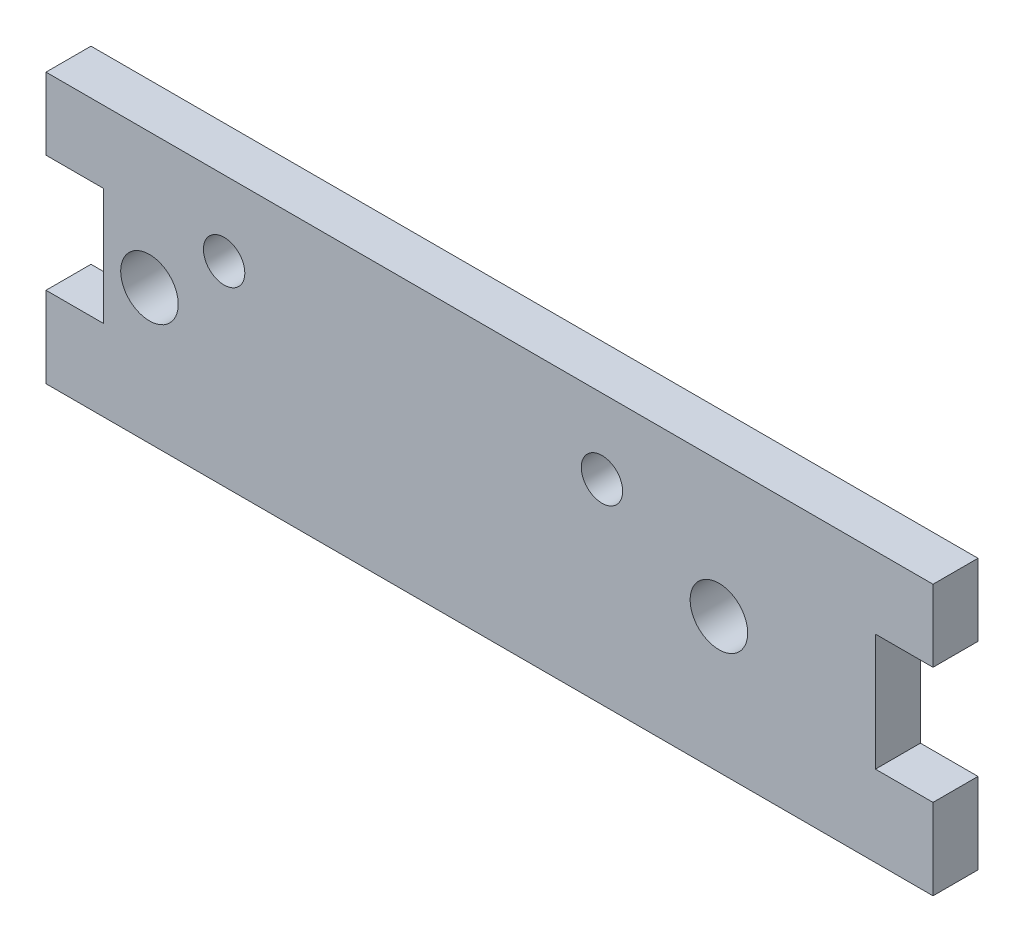
ISO-10303-21;
HEADER;
FILE_DESCRIPTION(('STEP AP214'),'2;1');
FILE_NAME('part.step','',(''),(''),'','','');
FILE_SCHEMA(('AUTOMOTIVE_DESIGN { 1 0 10303 214 1 1 1 1 }'));
ENDSEC;
DATA;
#1=APPLICATION_CONTEXT('core data for automotive mechanical design processes');
#2=APPLICATION_PROTOCOL_DEFINITION('international standard','automotive_design',2000,#1);
#3=PRODUCT_CONTEXT('',#1,'mechanical');
#4=PRODUCT('Part','Part','',(#3));
#5=PRODUCT_RELATED_PRODUCT_CATEGORY('part','',(#4));
#6=PRODUCT_DEFINITION_FORMATION('','',#4);
#7=PRODUCT_DEFINITION_CONTEXT('part definition',#1,'design');
#8=PRODUCT_DEFINITION('design','',#6,#7);
#9=PRODUCT_DEFINITION_SHAPE('','',#8);
#10=(LENGTH_UNIT() NAMED_UNIT(*) SI_UNIT(.MILLI.,.METRE.));
#11=(NAMED_UNIT(*) PLANE_ANGLE_UNIT() SI_UNIT($,.RADIAN.));
#12=(NAMED_UNIT(*) SI_UNIT($,.STERADIAN.) SOLID_ANGLE_UNIT());
#13=UNCERTAINTY_MEASURE_WITH_UNIT(LENGTH_MEASURE(1.E-05),#10,'distance_accuracy_value','');
#14=(GEOMETRIC_REPRESENTATION_CONTEXT(3) GLOBAL_UNCERTAINTY_ASSIGNED_CONTEXT((#13)) GLOBAL_UNIT_ASSIGNED_CONTEXT((#10,
#11,#12)) REPRESENTATION_CONTEXT('',''));
#15=CARTESIAN_POINT('',(0.,0.,0.));
#16=DIRECTION('',(0.,0.,1.));
#17=DIRECTION('',(1.,0.,0.));
#18=AXIS2_PLACEMENT_3D('',#15,#16,#17);
#19=CARTESIAN_POINT('',(49.3,0.,2.5));
#20=DIRECTION('',(-1.,0.,0.));
#21=DIRECTION('',(0.,0.,1.));
#22=AXIS2_PLACEMENT_3D('',#19,#20,#21);
#23=PLANE('',#22);
#24=DIRECTION('',(0.,0.,1.));
#25=VECTOR('',#24,1.);
#26=CARTESIAN_POINT('',(49.3,4.5,-7.5));
#27=LINE('',#26,#25);
#28=CARTESIAN_POINT('',(49.3,4.5,0.));
#29=VERTEX_POINT('',#28);
#30=CARTESIAN_POINT('',(49.3,4.5,2.5));
#31=VERTEX_POINT('',#30);
#32=EDGE_CURVE('E212',#29,#31,#27,.T.);
#33=ORIENTED_EDGE('',*,*,#32,.T.);
#34=DIRECTION('',(0.,1.,0.));
#35=VECTOR('',#34,1.);
#36=CARTESIAN_POINT('',(49.3,0.,2.5));
#37=LINE('',#36,#35);
#38=CARTESIAN_POINT('',(49.3,0.,2.5));
#39=VERTEX_POINT('',#38);
#40=EDGE_CURVE('E155',#39,#31,#37,.T.);
#41=ORIENTED_EDGE('',*,*,#40,.F.);
#42=DIRECTION('',(0.,0.,-1.));
#43=VECTOR('',#42,1.);
#44=CARTESIAN_POINT('',(49.3,0.,2.5));
#45=LINE('',#44,#43);
#46=CARTESIAN_POINT('',(49.3,0.,0.));
#47=VERTEX_POINT('',#46);
#48=EDGE_CURVE('E181',#39,#47,#45,.T.);
#49=ORIENTED_EDGE('',*,*,#48,.T.);
#50=DIRECTION('',(0.,1.,0.));
#51=VECTOR('',#50,1.);
#52=CARTESIAN_POINT('',(49.3,0.,0.));
#53=LINE('',#52,#51);
#54=EDGE_CURVE('E175',#47,#29,#53,.T.);
#55=ORIENTED_EDGE('',*,*,#54,.T.);
#56=EDGE_LOOP('',(#33,#41,#49,#55));
#57=FACE_BOUND('',#56,.T.);
#58=ADVANCED_FACE('F41',(#57),#23,.F.);
#59=DIRECTION('',(0.,0.,1.));
#60=VECTOR('',#59,1.);
#61=CARTESIAN_POINT('',(49.3,11.,-7.5));
#62=LINE('',#61,#60);
#63=CARTESIAN_POINT('',(49.3,11.,0.));
#64=VERTEX_POINT('',#63);
#65=CARTESIAN_POINT('',(49.3,11.,2.5));
#66=VERTEX_POINT('',#65);
#67=EDGE_CURVE('E128',#64,#66,#62,.T.);
#68=ORIENTED_EDGE('',*,*,#67,.F.);
#69=CARTESIAN_POINT('',(49.3,15.,0.));
#70=VERTEX_POINT('',#69);
#71=EDGE_CURVE('E171',#64,#70,#53,.T.);
#72=ORIENTED_EDGE('',*,*,#71,.T.);
#73=DIRECTION('',(0.,0.,-1.));
#74=VECTOR('',#73,1.);
#75=CARTESIAN_POINT('',(49.3,15.,2.5));
#76=LINE('',#75,#74);
#77=CARTESIAN_POINT('',(49.3,15.,2.5));
#78=VERTEX_POINT('',#77);
#79=EDGE_CURVE('E154',#78,#70,#76,.T.);
#80=ORIENTED_EDGE('',*,*,#79,.F.);
#81=EDGE_CURVE('E143',#66,#78,#37,.T.);
#82=ORIENTED_EDGE('',*,*,#81,.F.);
#83=EDGE_LOOP('',(#68,#72,#80,#82));
#84=FACE_BOUND('',#83,.T.);
#85=ADVANCED_FACE('F148',(#84),#23,.F.);
#86=CARTESIAN_POINT('',(0.,0.,2.5));
#87=DIRECTION('',(0.,0.,-1.));
#88=DIRECTION('',(-1.,0.,0.));
#89=AXIS2_PLACEMENT_3D('',#86,#87,#88);
#90=PLANE('',#89);
#91=CARTESIAN_POINT('',(9.9,10.85,2.5));
#92=DIRECTION('',(0.,0.,1.));
#93=DIRECTION('',(1.,0.,0.));
#94=AXIS2_PLACEMENT_3D('',#91,#92,#93);
#95=CIRCLE('',#94,1.15);
#96=CARTESIAN_POINT('',(11.05,10.85,2.5));
#97=VERTEX_POINT('',#96);
#98=EDGE_CURVE('E199',#97,#97,#95,.T.);
#99=ORIENTED_EDGE('',*,*,#98,.F.);
#100=EDGE_LOOP('',(#99));
#101=FACE_BOUND('',#100,.T.);
#102=CARTESIAN_POINT('',(30.9,10.85,2.5));
#103=DIRECTION('',(0.,0.,1.));
#104=DIRECTION('',(1.,0.,0.));
#105=AXIS2_PLACEMENT_3D('',#102,#103,#104);
#106=CIRCLE('',#105,1.15);
#107=CARTESIAN_POINT('',(32.05,10.85,2.5));
#108=VERTEX_POINT('',#107);
#109=EDGE_CURVE('E205',#108,#108,#106,.T.);
#110=ORIENTED_EDGE('',*,*,#109,.F.);
#111=EDGE_LOOP('',(#110));
#112=FACE_BOUND('',#111,.T.);
#113=CARTESIAN_POINT('',(37.4,7.5,2.5));
#114=DIRECTION('',(0.,0.,-1.));
#115=DIRECTION('',(-1.,0.,0.));
#116=AXIS2_PLACEMENT_3D('',#113,#114,#115);
#117=CIRCLE('',#116,1.6);
#118=CARTESIAN_POINT('',(35.8,7.5,2.5));
#119=VERTEX_POINT('',#118);
#120=EDGE_CURVE('E226',#119,#119,#117,.T.);
#121=ORIENTED_EDGE('',*,*,#120,.T.);
#122=EDGE_LOOP('',(#121));
#123=FACE_BOUND('',#122,.T.);
#124=CARTESIAN_POINT('',(5.75,7.5,2.5));
#125=DIRECTION('',(0.,0.,-1.));
#126=DIRECTION('',(-1.,0.,0.));
#127=AXIS2_PLACEMENT_3D('',#124,#125,#126);
#128=CIRCLE('',#127,1.6);
#129=CARTESIAN_POINT('',(4.15,7.5,2.5));
#130=VERTEX_POINT('',#129);
#131=EDGE_CURVE('E231',#130,#130,#128,.T.);
#132=ORIENTED_EDGE('',*,*,#131,.T.);
#133=EDGE_LOOP('',(#132));
#134=FACE_BOUND('',#133,.T.);
#135=DIRECTION('',(-1.,0.,0.));
#136=VECTOR('',#135,1.);
#137=CARTESIAN_POINT('',(49.3,4.5,2.5));
#138=LINE('',#137,#136);
#139=CARTESIAN_POINT('',(46.1,4.5,2.5));
#140=VERTEX_POINT('',#139);
#141=EDGE_CURVE('E138',#31,#140,#138,.T.);
#142=ORIENTED_EDGE('',*,*,#141,.T.);
#143=DIRECTION('',(0.,1.,0.));
#144=VECTOR('',#143,1.);
#145=CARTESIAN_POINT('',(46.1,11.,2.5));
#146=LINE('',#145,#144);
#147=CARTESIAN_POINT('',(46.1,11.,2.5));
#148=VERTEX_POINT('',#147);
#149=EDGE_CURVE('E149',#140,#148,#146,.T.);
#150=ORIENTED_EDGE('',*,*,#149,.T.);
#151=DIRECTION('',(1.,0.,0.));
#152=VECTOR('',#151,1.);
#153=CARTESIAN_POINT('',(49.3,11.,2.5));
#154=LINE('',#153,#152);
#155=EDGE_CURVE('E132',#148,#66,#154,.T.);
#156=ORIENTED_EDGE('',*,*,#155,.T.);
#157=ORIENTED_EDGE('',*,*,#81,.T.);
#158=DIRECTION('',(-1.,0.,0.));
#159=VECTOR('',#158,1.);
#160=CARTESIAN_POINT('',(0.,15.,2.5));
#161=LINE('',#160,#159);
#162=CARTESIAN_POINT('',(0.,15.,2.5));
#163=VERTEX_POINT('',#162);
#164=EDGE_CURVE('E159',#78,#163,#161,.T.);
#165=ORIENTED_EDGE('',*,*,#164,.T.);
#166=DIRECTION('',(0.,-1.,0.));
#167=VECTOR('',#166,1.);
#168=CARTESIAN_POINT('',(0.,0.,2.5));
#169=LINE('',#168,#167);
#170=CARTESIAN_POINT('',(0.,11.,2.5));
#171=VERTEX_POINT('',#170);
#172=EDGE_CURVE('E156',#163,#171,#169,.T.);
#173=ORIENTED_EDGE('',*,*,#172,.T.);
#174=DIRECTION('',(-1.,0.,0.));
#175=VECTOR('',#174,1.);
#176=CARTESIAN_POINT('',(0.,11.,2.5));
#177=LINE('',#176,#175);
#178=CARTESIAN_POINT('',(3.2,11.,2.5));
#179=VERTEX_POINT('',#178);
#180=EDGE_CURVE('E225',#179,#171,#177,.T.);
#181=ORIENTED_EDGE('',*,*,#180,.F.);
#182=DIRECTION('',(0.,1.,0.));
#183=VECTOR('',#182,1.);
#184=CARTESIAN_POINT('',(3.2,11.,2.5));
#185=LINE('',#184,#183);
#186=CARTESIAN_POINT('',(3.2,4.5,2.5));
#187=VERTEX_POINT('',#186);
#188=EDGE_CURVE('E220',#187,#179,#185,.T.);
#189=ORIENTED_EDGE('',*,*,#188,.F.);
#190=DIRECTION('',(1.,0.,0.));
#191=VECTOR('',#190,1.);
#192=CARTESIAN_POINT('',(0.,4.5,2.5));
#193=LINE('',#192,#191);
#194=CARTESIAN_POINT('',(0.,4.5,2.5));
#195=VERTEX_POINT('',#194);
#196=EDGE_CURVE('E211',#195,#187,#193,.T.);
#197=ORIENTED_EDGE('',*,*,#196,.F.);
#198=CARTESIAN_POINT('',(0.,0.,2.5));
#199=VERTEX_POINT('',#198);
#200=EDGE_CURVE('E180',#195,#199,#169,.T.);
#201=ORIENTED_EDGE('',*,*,#200,.T.);
#202=DIRECTION('',(1.,0.,0.));
#203=VECTOR('',#202,1.);
#204=CARTESIAN_POINT('',(0.,0.,2.5));
#205=LINE('',#204,#203);
#206=EDGE_CURVE('E151',#199,#39,#205,.T.);
#207=ORIENTED_EDGE('',*,*,#206,.T.);
#208=ORIENTED_EDGE('',*,*,#40,.T.);
#209=EDGE_LOOP('',(#142,#150,#156,#157,#165,#173,#181,#189,#197,#201,#207,#208));
#210=FACE_BOUND('',#209,.T.);
#211=ADVANCED_FACE('F144',(#101,#112,#123,#134,#210),#90,.F.);
#212=CARTESIAN_POINT('',(0.,0.,0.));
#213=DIRECTION('',(0.,0.,-1.));
#214=DIRECTION('',(-1.,0.,0.));
#215=AXIS2_PLACEMENT_3D('',#212,#213,#214);
#216=PLANE('',#215);
#217=CARTESIAN_POINT('',(9.9,10.85,0.));
#218=DIRECTION('',(0.,0.,-1.));
#219=DIRECTION('',(-1.,0.,0.));
#220=AXIS2_PLACEMENT_3D('',#217,#218,#219);
#221=CIRCLE('',#220,1.15);
#222=CARTESIAN_POINT('',(8.75,10.85,0.));
#223=VERTEX_POINT('',#222);
#224=EDGE_CURVE('E44',#223,#223,#221,.T.);
#225=ORIENTED_EDGE('',*,*,#224,.F.);
#226=EDGE_LOOP('',(#225));
#227=FACE_BOUND('',#226,.T.);
#228=CARTESIAN_POINT('',(30.9,10.85,0.));
#229=DIRECTION('',(0.,0.,-1.));
#230=DIRECTION('',(-1.,0.,0.));
#231=AXIS2_PLACEMENT_3D('',#228,#229,#230);
#232=CIRCLE('',#231,1.15);
#233=CARTESIAN_POINT('',(29.75,10.85,0.));
#234=VERTEX_POINT('',#233);
#235=EDGE_CURVE('E193',#234,#234,#232,.T.);
#236=ORIENTED_EDGE('',*,*,#235,.F.);
#237=EDGE_LOOP('',(#236));
#238=FACE_BOUND('',#237,.T.);
#239=CARTESIAN_POINT('',(5.75,7.5,0.));
#240=DIRECTION('',(0.,0.,-1.));
#241=DIRECTION('',(-1.,0.,0.));
#242=AXIS2_PLACEMENT_3D('',#239,#240,#241);
#243=CIRCLE('',#242,1.6);
#244=CARTESIAN_POINT('',(4.15,7.5,0.));
#245=VERTEX_POINT('',#244);
#246=EDGE_CURVE('E236',#245,#245,#243,.T.);
#247=ORIENTED_EDGE('',*,*,#246,.F.);
#248=EDGE_LOOP('',(#247));
#249=FACE_BOUND('',#248,.T.);
#250=CARTESIAN_POINT('',(37.4,7.5,0.));
#251=DIRECTION('',(0.,0.,-1.));
#252=DIRECTION('',(-1.,0.,0.));
#253=AXIS2_PLACEMENT_3D('',#250,#251,#252);
#254=CIRCLE('',#253,1.6);
#255=CARTESIAN_POINT('',(35.8,7.5,0.));
#256=VERTEX_POINT('',#255);
#257=EDGE_CURVE('E237',#256,#256,#254,.T.);
#258=ORIENTED_EDGE('',*,*,#257,.F.);
#259=EDGE_LOOP('',(#258));
#260=FACE_BOUND('',#259,.T.);
#261=DIRECTION('',(0.,-1.,0.));
#262=VECTOR('',#261,1.);
#263=CARTESIAN_POINT('',(46.1,0.,0.));
#264=LINE('',#263,#262);
#265=CARTESIAN_POINT('',(46.1,11.,0.));
#266=VERTEX_POINT('',#265);
#267=CARTESIAN_POINT('',(46.1,4.5,0.));
#268=VERTEX_POINT('',#267);
#269=EDGE_CURVE('E49',#266,#268,#264,.T.);
#270=ORIENTED_EDGE('',*,*,#269,.T.);
#271=DIRECTION('',(1.,0.,0.));
#272=VECTOR('',#271,1.);
#273=CARTESIAN_POINT('',(0.,4.5,0.));
#274=LINE('',#273,#272);
#275=EDGE_CURVE('E11',#268,#29,#274,.T.);
#276=ORIENTED_EDGE('',*,*,#275,.T.);
#277=ORIENTED_EDGE('',*,*,#54,.F.);
#278=DIRECTION('',(1.,0.,0.));
#279=VECTOR('',#278,1.);
#280=CARTESIAN_POINT('',(0.,0.,0.));
#281=LINE('',#280,#279);
#282=CARTESIAN_POINT('',(0.,0.,0.));
#283=VERTEX_POINT('',#282);
#284=EDGE_CURVE('E166',#283,#47,#281,.T.);
#285=ORIENTED_EDGE('',*,*,#284,.F.);
#286=DIRECTION('',(0.,-1.,0.));
#287=VECTOR('',#286,1.);
#288=CARTESIAN_POINT('',(0.,0.,0.));
#289=LINE('',#288,#287);
#290=CARTESIAN_POINT('',(0.,4.5,0.));
#291=VERTEX_POINT('',#290);
#292=EDGE_CURVE('E169',#291,#283,#289,.T.);
#293=ORIENTED_EDGE('',*,*,#292,.F.);
#294=DIRECTION('',(-1.,0.,0.));
#295=VECTOR('',#294,1.);
#296=CARTESIAN_POINT('',(0.,4.5,0.));
#297=LINE('',#296,#295);
#298=CARTESIAN_POINT('',(3.2,4.5,0.));
#299=VERTEX_POINT('',#298);
#300=EDGE_CURVE('E190',#299,#291,#297,.T.);
#301=ORIENTED_EDGE('',*,*,#300,.F.);
#302=DIRECTION('',(0.,-1.,0.));
#303=VECTOR('',#302,1.);
#304=CARTESIAN_POINT('',(3.2,0.,0.));
#305=LINE('',#304,#303);
#306=CARTESIAN_POINT('',(3.2,11.,0.));
#307=VERTEX_POINT('',#306);
#308=EDGE_CURVE('E186',#307,#299,#305,.T.);
#309=ORIENTED_EDGE('',*,*,#308,.F.);
#310=DIRECTION('',(1.,0.,0.));
#311=VECTOR('',#310,1.);
#312=CARTESIAN_POINT('',(0.,11.,0.));
#313=LINE('',#312,#311);
#314=CARTESIAN_POINT('',(0.,11.,0.));
#315=VERTEX_POINT('',#314);
#316=EDGE_CURVE('E192',#315,#307,#313,.T.);
#317=ORIENTED_EDGE('',*,*,#316,.F.);
#318=CARTESIAN_POINT('',(0.,15.,0.));
#319=VERTEX_POINT('',#318);
#320=EDGE_CURVE('E164',#319,#315,#289,.T.);
#321=ORIENTED_EDGE('',*,*,#320,.F.);
#322=DIRECTION('',(-1.,0.,0.));
#323=VECTOR('',#322,1.);
#324=CARTESIAN_POINT('',(0.,15.,0.));
#325=LINE('',#324,#323);
#326=EDGE_CURVE('E174',#70,#319,#325,.T.);
#327=ORIENTED_EDGE('',*,*,#326,.F.);
#328=ORIENTED_EDGE('',*,*,#71,.F.);
#329=DIRECTION('',(-1.,0.,0.));
#330=VECTOR('',#329,1.);
#331=CARTESIAN_POINT('',(0.,11.,0.));
#332=LINE('',#331,#330);
#333=EDGE_CURVE('E137',#64,#266,#332,.T.);
#334=ORIENTED_EDGE('',*,*,#333,.T.);
#335=EDGE_LOOP('',(#270,#276,#277,#285,#293,#301,#309,#317,#321,#327,#328,#334));
#336=FACE_BOUND('',#335,.T.);
#337=ADVANCED_FACE('F264',(#227,#238,#249,#260,#336),#216,.T.);
#338=CARTESIAN_POINT('',(0.,0.,2.5));
#339=DIRECTION('',(1.,0.,0.));
#340=DIRECTION('',(0.,0.,-1.));
#341=AXIS2_PLACEMENT_3D('',#338,#339,#340);
#342=PLANE('',#341);
#343=ORIENTED_EDGE('',*,*,#320,.T.);
#344=DIRECTION('',(0.,0.,1.));
#345=VECTOR('',#344,1.);
#346=CARTESIAN_POINT('',(0.,11.,-7.5));
#347=LINE('',#346,#345);
#348=EDGE_CURVE('E223',#315,#171,#347,.T.);
#349=ORIENTED_EDGE('',*,*,#348,.T.);
#350=ORIENTED_EDGE('',*,*,#172,.F.);
#351=DIRECTION('',(0.,0.,-1.));
#352=VECTOR('',#351,1.);
#353=CARTESIAN_POINT('',(0.,15.,2.5));
#354=LINE('',#353,#352);
#355=EDGE_CURVE('E165',#163,#319,#354,.T.);
#356=ORIENTED_EDGE('',*,*,#355,.T.);
#357=EDGE_LOOP('',(#343,#349,#350,#356));
#358=FACE_BOUND('',#357,.T.);
#359=ADVANCED_FACE('F273',(#358),#342,.F.);
#360=ORIENTED_EDGE('',*,*,#200,.F.);
#361=DIRECTION('',(0.,0.,1.));
#362=VECTOR('',#361,1.);
#363=CARTESIAN_POINT('',(0.,4.5,-7.5));
#364=LINE('',#363,#362);
#365=EDGE_CURVE('E221',#291,#195,#364,.T.);
#366=ORIENTED_EDGE('',*,*,#365,.F.);
#367=ORIENTED_EDGE('',*,*,#292,.T.);
#368=DIRECTION('',(0.,0.,-1.));
#369=VECTOR('',#368,1.);
#370=CARTESIAN_POINT('',(0.,0.,2.5));
#371=LINE('',#370,#369);
#372=EDGE_CURVE('E183',#199,#283,#371,.T.);
#373=ORIENTED_EDGE('',*,*,#372,.F.);
#374=EDGE_LOOP('',(#360,#366,#367,#373));
#375=FACE_BOUND('',#374,.T.);
#376=ADVANCED_FACE('F43',(#375),#342,.F.);
#377=CARTESIAN_POINT('',(0.,0.,2.5));
#378=DIRECTION('',(0.,1.,0.));
#379=DIRECTION('',(0.,0.,1.));
#380=AXIS2_PLACEMENT_3D('',#377,#378,#379);
#381=PLANE('',#380);
#382=ORIENTED_EDGE('',*,*,#284,.T.);
#383=ORIENTED_EDGE('',*,*,#48,.F.);
#384=ORIENTED_EDGE('',*,*,#206,.F.);
#385=ORIENTED_EDGE('',*,*,#372,.T.);
#386=EDGE_LOOP('',(#382,#383,#384,#385));
#387=FACE_BOUND('',#386,.T.);
#388=ADVANCED_FACE('F253',(#387),#381,.F.);
#389=CARTESIAN_POINT('',(0.,15.,2.5));
#390=DIRECTION('',(0.,-1.,0.));
#391=DIRECTION('',(0.,0.,-1.));
#392=AXIS2_PLACEMENT_3D('',#389,#390,#391);
#393=PLANE('',#392);
#394=ORIENTED_EDGE('',*,*,#326,.T.);
#395=ORIENTED_EDGE('',*,*,#355,.F.);
#396=ORIENTED_EDGE('',*,*,#164,.F.);
#397=ORIENTED_EDGE('',*,*,#79,.T.);
#398=EDGE_LOOP('',(#394,#395,#396,#397));
#399=FACE_BOUND('',#398,.T.);
#400=ADVANCED_FACE('F275',(#399),#393,.F.);
#401=CARTESIAN_POINT('',(37.4,7.5,2.5));
#402=DIRECTION('',(0.,0.,-1.));
#403=DIRECTION('',(-1.,0.,0.));
#404=AXIS2_PLACEMENT_3D('',#401,#402,#403);
#405=CYLINDRICAL_SURFACE('',#404,1.6);
#406=ORIENTED_EDGE('',*,*,#120,.F.);
#407=EDGE_LOOP('',(#406));
#408=FACE_BOUND('',#407,.T.);
#409=ORIENTED_EDGE('',*,*,#257,.T.);
#410=EDGE_LOOP('',(#409));
#411=FACE_BOUND('',#410,.T.);
#412=ADVANCED_FACE('F302',(#408,#411),#405,.F.);
#413=CARTESIAN_POINT('',(5.75,7.5,2.5));
#414=DIRECTION('',(0.,0.,-1.));
#415=DIRECTION('',(-1.,0.,0.));
#416=AXIS2_PLACEMENT_3D('',#413,#414,#415);
#417=CYLINDRICAL_SURFACE('',#416,1.6);
#418=ORIENTED_EDGE('',*,*,#131,.F.);
#419=EDGE_LOOP('',(#418));
#420=FACE_BOUND('',#419,.T.);
#421=ORIENTED_EDGE('',*,*,#246,.T.);
#422=EDGE_LOOP('',(#421));
#423=FACE_BOUND('',#422,.T.);
#424=ADVANCED_FACE('F323',(#420,#423),#417,.F.);
#425=CARTESIAN_POINT('',(0.,11.,-7.5));
#426=DIRECTION('',(0.,1.,0.));
#427=DIRECTION('',(0.,0.,1.));
#428=AXIS2_PLACEMENT_3D('',#425,#426,#427);
#429=PLANE('',#428);
#430=ORIENTED_EDGE('',*,*,#316,.T.);
#431=DIRECTION('',(0.,0.,1.));
#432=VECTOR('',#431,1.);
#433=CARTESIAN_POINT('',(3.2,11.,-7.5));
#434=LINE('',#433,#432);
#435=EDGE_CURVE('E230',#307,#179,#434,.T.);
#436=ORIENTED_EDGE('',*,*,#435,.T.);
#437=ORIENTED_EDGE('',*,*,#180,.T.);
#438=ORIENTED_EDGE('',*,*,#348,.F.);
#439=EDGE_LOOP('',(#430,#436,#437,#438));
#440=FACE_BOUND('',#439,.T.);
#441=ADVANCED_FACE('F279',(#440),#429,.F.);
#442=CARTESIAN_POINT('',(3.2,11.,-7.5));
#443=DIRECTION('',(1.,0.,0.));
#444=DIRECTION('',(0.,1.,0.));
#445=AXIS2_PLACEMENT_3D('',#442,#443,#444);
#446=PLANE('',#445);
#447=ORIENTED_EDGE('',*,*,#308,.T.);
#448=DIRECTION('',(0.,0.,1.));
#449=VECTOR('',#448,1.);
#450=CARTESIAN_POINT('',(3.2,4.5,-7.5));
#451=LINE('',#450,#449);
#452=EDGE_CURVE('E68',#299,#187,#451,.T.);
#453=ORIENTED_EDGE('',*,*,#452,.T.);
#454=ORIENTED_EDGE('',*,*,#188,.T.);
#455=ORIENTED_EDGE('',*,*,#435,.F.);
#456=EDGE_LOOP('',(#447,#453,#454,#455));
#457=FACE_BOUND('',#456,.T.);
#458=ADVANCED_FACE('F284',(#457),#446,.F.);
#459=CARTESIAN_POINT('',(0.,4.5,-7.5));
#460=DIRECTION('',(0.,-1.,0.));
#461=DIRECTION('',(0.,0.,-1.));
#462=AXIS2_PLACEMENT_3D('',#459,#460,#461);
#463=PLANE('',#462);
#464=ORIENTED_EDGE('',*,*,#300,.T.);
#465=ORIENTED_EDGE('',*,*,#365,.T.);
#466=ORIENTED_EDGE('',*,*,#196,.T.);
#467=ORIENTED_EDGE('',*,*,#452,.F.);
#468=EDGE_LOOP('',(#464,#465,#466,#467));
#469=FACE_BOUND('',#468,.T.);
#470=ADVANCED_FACE('F282',(#469),#463,.F.);
#471=CARTESIAN_POINT('',(49.3,4.5,-7.5));
#472=DIRECTION('',(0.,1.,0.));
#473=DIRECTION('',(0.,0.,1.));
#474=AXIS2_PLACEMENT_3D('',#471,#472,#473);
#475=PLANE('',#474);
#476=DIRECTION('',(0.,0.,1.));
#477=VECTOR('',#476,1.);
#478=CARTESIAN_POINT('',(46.1,4.5,-7.5));
#479=LINE('',#478,#477);
#480=EDGE_CURVE('E213',#268,#140,#479,.T.);
#481=ORIENTED_EDGE('',*,*,#480,.T.);
#482=ORIENTED_EDGE('',*,*,#141,.F.);
#483=ORIENTED_EDGE('',*,*,#32,.F.);
#484=ORIENTED_EDGE('',*,*,#275,.F.);
#485=EDGE_LOOP('',(#481,#482,#483,#484));
#486=FACE_BOUND('',#485,.T.);
#487=ADVANCED_FACE('F261',(#486),#475,.T.);
#488=CARTESIAN_POINT('',(46.1,11.,-7.5));
#489=DIRECTION('',(1.,0.,0.));
#490=DIRECTION('',(0.,1.,0.));
#491=AXIS2_PLACEMENT_3D('',#488,#489,#490);
#492=PLANE('',#491);
#493=DIRECTION('',(0.,0.,1.));
#494=VECTOR('',#493,1.);
#495=CARTESIAN_POINT('',(46.1,11.,-7.5));
#496=LINE('',#495,#494);
#497=EDGE_CURVE('E59',#266,#148,#496,.T.);
#498=ORIENTED_EDGE('',*,*,#497,.T.);
#499=ORIENTED_EDGE('',*,*,#149,.F.);
#500=ORIENTED_EDGE('',*,*,#480,.F.);
#501=ORIENTED_EDGE('',*,*,#269,.F.);
#502=EDGE_LOOP('',(#498,#499,#500,#501));
#503=FACE_BOUND('',#502,.T.);
#504=ADVANCED_FACE('F269',(#503),#492,.T.);
#505=CARTESIAN_POINT('',(49.3,11.,-7.5));
#506=DIRECTION('',(0.,-1.,0.));
#507=DIRECTION('',(0.,0.,-1.));
#508=AXIS2_PLACEMENT_3D('',#505,#506,#507);
#509=PLANE('',#508);
#510=ORIENTED_EDGE('',*,*,#67,.T.);
#511=ORIENTED_EDGE('',*,*,#155,.F.);
#512=ORIENTED_EDGE('',*,*,#497,.F.);
#513=ORIENTED_EDGE('',*,*,#333,.F.);
#514=EDGE_LOOP('',(#510,#511,#512,#513));
#515=FACE_BOUND('',#514,.T.);
#516=ADVANCED_FACE('F134',(#515),#509,.T.);
#517=CARTESIAN_POINT('',(30.9,10.85,-7.5));
#518=DIRECTION('',(0.,0.,1.));
#519=DIRECTION('',(1.,0.,0.));
#520=AXIS2_PLACEMENT_3D('',#517,#518,#519);
#521=CYLINDRICAL_SURFACE('',#520,1.15);
#522=ORIENTED_EDGE('',*,*,#235,.T.);
#523=EDGE_LOOP('',(#522));
#524=FACE_BOUND('',#523,.T.);
#525=ORIENTED_EDGE('',*,*,#109,.T.);
#526=EDGE_LOOP('',(#525));
#527=FACE_BOUND('',#526,.T.);
#528=ADVANCED_FACE('F341',(#524,#527),#521,.F.);
#529=CARTESIAN_POINT('',(9.9,10.85,-7.5));
#530=DIRECTION('',(0.,0.,1.));
#531=DIRECTION('',(1.,0.,0.));
#532=AXIS2_PLACEMENT_3D('',#529,#530,#531);
#533=CYLINDRICAL_SURFACE('',#532,1.15);
#534=ORIENTED_EDGE('',*,*,#224,.T.);
#535=EDGE_LOOP('',(#534));
#536=FACE_BOUND('',#535,.T.);
#537=ORIENTED_EDGE('',*,*,#98,.T.);
#538=EDGE_LOOP('',(#537));
#539=FACE_BOUND('',#538,.T.);
#540=ADVANCED_FACE('F347',(#536,#539),#533,.F.);
#541=CLOSED_SHELL('',(#58,#85,#211,#337,#359,#376,#388,#400,#412,#424,#441,#458,#470,#487,#504,
#516,#528,#540));
#542=MANIFOLD_SOLID_BREP('B2',#541);
#543=ADVANCED_BREP_SHAPE_REPRESENTATION('',(#18,#542),#14);
#544=SHAPE_DEFINITION_REPRESENTATION(#9,#543);
ENDSEC;
END-ISO-10303-21;
